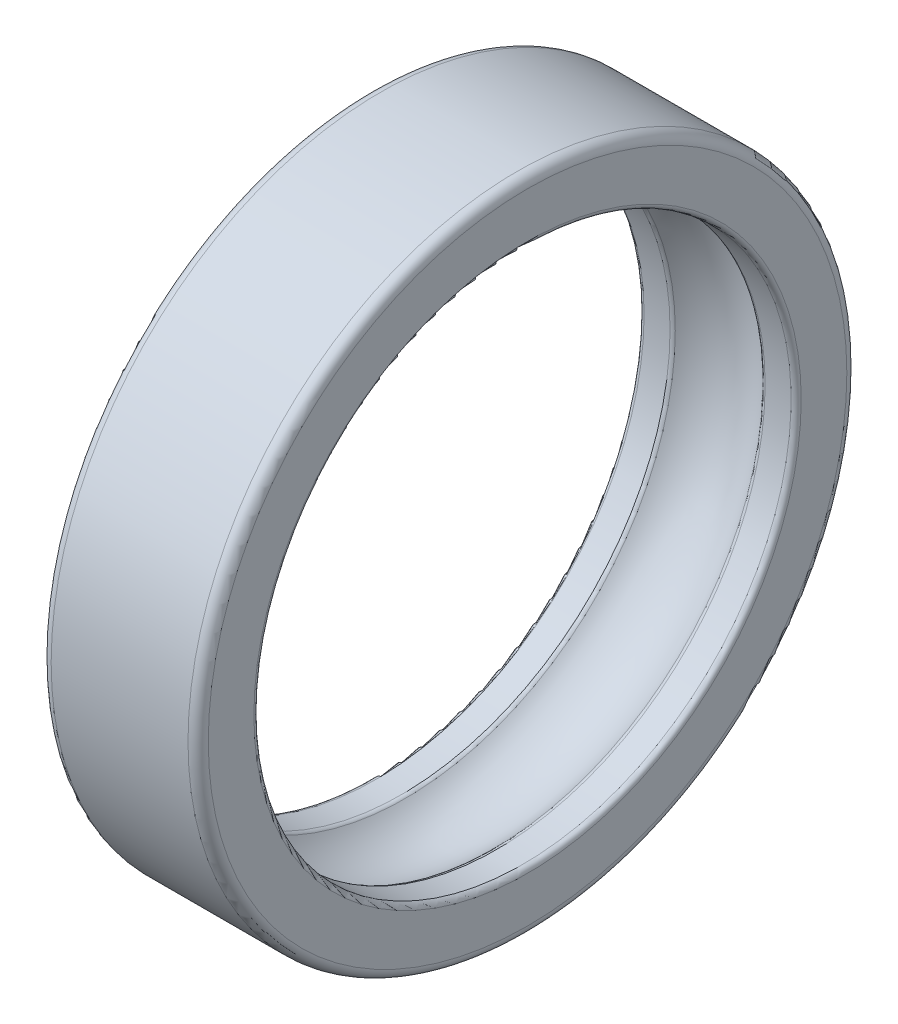
ISO-10303-21;
HEADER;
FILE_DESCRIPTION(('STEP AP214'),'2;1');
FILE_NAME('part.step','',(''),(''),'','','');
FILE_SCHEMA(('AUTOMOTIVE_DESIGN { 1 0 10303 214 1 1 1 1 }'));
ENDSEC;
DATA;
#1=APPLICATION_CONTEXT('core data for automotive mechanical design processes');
#2=APPLICATION_PROTOCOL_DEFINITION('international standard','automotive_design',2000,#1);
#3=PRODUCT_CONTEXT('',#1,'mechanical');
#4=PRODUCT('Part','Part','',(#3));
#5=PRODUCT_RELATED_PRODUCT_CATEGORY('part','',(#4));
#6=PRODUCT_DEFINITION_FORMATION('','',#4);
#7=PRODUCT_DEFINITION_CONTEXT('part definition',#1,'design');
#8=PRODUCT_DEFINITION('design','',#6,#7);
#9=PRODUCT_DEFINITION_SHAPE('','',#8);
#10=(LENGTH_UNIT() NAMED_UNIT(*) SI_UNIT(.MILLI.,.METRE.));
#11=(NAMED_UNIT(*) PLANE_ANGLE_UNIT() SI_UNIT($,.RADIAN.));
#12=(NAMED_UNIT(*) SI_UNIT($,.STERADIAN.) SOLID_ANGLE_UNIT());
#13=UNCERTAINTY_MEASURE_WITH_UNIT(LENGTH_MEASURE(1.E-05),#10,'distance_accuracy_value','');
#14=(GEOMETRIC_REPRESENTATION_CONTEXT(3) GLOBAL_UNCERTAINTY_ASSIGNED_CONTEXT((#13)) GLOBAL_UNIT_ASSIGNED_CONTEXT((#10,
#11,#12)) REPRESENTATION_CONTEXT('',''));
#15=CARTESIAN_POINT('',(0.,0.,0.));
#16=DIRECTION('',(0.,0.,1.));
#17=DIRECTION('',(1.,0.,0.));
#18=AXIS2_PLACEMENT_3D('',#15,#16,#17);
#19=CARTESIAN_POINT('',(15.5,63.,0.));
#20=DIRECTION('',(-1.,0.,0.));
#21=DIRECTION('',(0.,0.,1.));
#22=AXIS2_PLACEMENT_3D('',#19,#20,#21);
#23=PLANE('',#22);
#24=CARTESIAN_POINT('',(15.5,0.,0.));
#25=DIRECTION('',(-1.,0.,0.));
#26=DIRECTION('',(0.,0.,1.));
#27=AXIS2_PLACEMENT_3D('',#24,#25,#26);
#28=CIRCLE('',#27,54.);
#29=CARTESIAN_POINT('',(15.5,0.,54.));
#30=VERTEX_POINT('',#29);
#31=EDGE_CURVE('E48',#30,#30,#28,.T.);
#32=ORIENTED_EDGE('',*,*,#31,.T.);
#33=EDGE_LOOP('',(#32));
#34=FACE_BOUND('',#33,.T.);
#35=CARTESIAN_POINT('',(15.5,0.,0.));
#36=DIRECTION('',(-1.,0.,0.));
#37=DIRECTION('',(0.,0.,1.));
#38=AXIS2_PLACEMENT_3D('',#35,#36,#37);
#39=CIRCLE('',#38,63.);
#40=CARTESIAN_POINT('',(15.5,0.,63.));
#41=VERTEX_POINT('',#40);
#42=EDGE_CURVE('E65',#41,#41,#39,.T.);
#43=ORIENTED_EDGE('',*,*,#42,.F.);
#44=EDGE_LOOP('',(#43));
#45=FACE_BOUND('',#44,.T.);
#46=ADVANCED_FACE('F33',(#34,#45),#23,.F.);
#47=CARTESIAN_POINT('',(13.5,0.,0.));
#48=DIRECTION('',(-1.,0.,0.));
#49=DIRECTION('',(0.,0.,1.));
#50=AXIS2_PLACEMENT_3D('',#47,#48,#49);
#51=TOROIDAL_SURFACE('',#50,63.,2.);
#52=CARTESIAN_POINT('',(13.5,0.,0.));
#53=DIRECTION('',(-1.,0.,0.));
#54=DIRECTION('',(0.,0.,1.));
#55=AXIS2_PLACEMENT_3D('',#52,#53,#54);
#56=CIRCLE('',#55,65.);
#57=CARTESIAN_POINT('',(13.5,0.,65.));
#58=VERTEX_POINT('',#57);
#59=EDGE_CURVE('E68',#58,#58,#56,.T.);
#60=ORIENTED_EDGE('',*,*,#59,.F.);
#61=EDGE_LOOP('',(#60));
#62=FACE_BOUND('',#61,.T.);
#63=ORIENTED_EDGE('',*,*,#42,.T.);
#64=EDGE_LOOP('',(#63));
#65=FACE_BOUND('',#64,.T.);
#66=ADVANCED_FACE('F89',(#62,#65),#51,.T.);
#67=CARTESIAN_POINT('',(0.,0.,0.));
#68=DIRECTION('',(-1.,0.,0.));
#69=DIRECTION('',(0.,0.,1.));
#70=AXIS2_PLACEMENT_3D('',#67,#68,#69);
#71=CYLINDRICAL_SURFACE('',#70,65.);
#72=CARTESIAN_POINT('',(-13.5,0.,0.));
#73=DIRECTION('',(-1.,0.,0.));
#74=DIRECTION('',(0.,0.,1.));
#75=AXIS2_PLACEMENT_3D('',#72,#73,#74);
#76=CIRCLE('',#75,65.);
#77=CARTESIAN_POINT('',(-13.5,0.,65.));
#78=VERTEX_POINT('',#77);
#79=EDGE_CURVE('E71',#78,#78,#76,.T.);
#80=ORIENTED_EDGE('',*,*,#79,.F.);
#81=EDGE_LOOP('',(#80));
#82=FACE_BOUND('',#81,.T.);
#83=ORIENTED_EDGE('',*,*,#59,.T.);
#84=EDGE_LOOP('',(#83));
#85=FACE_BOUND('',#84,.T.);
#86=ADVANCED_FACE('F83',(#82,#85),#71,.T.);
#87=CARTESIAN_POINT('',(-13.5,0.,0.));
#88=DIRECTION('',(-1.,0.,0.));
#89=DIRECTION('',(0.,0.,1.));
#90=AXIS2_PLACEMENT_3D('',#87,#88,#89);
#91=TOROIDAL_SURFACE('',#90,63.,2.);
#92=CARTESIAN_POINT('',(-15.5,0.,0.));
#93=DIRECTION('',(-1.,0.,0.));
#94=DIRECTION('',(0.,0.,1.));
#95=AXIS2_PLACEMENT_3D('',#92,#93,#94);
#96=CIRCLE('',#95,63.);
#97=CARTESIAN_POINT('',(-15.5,0.,63.));
#98=VERTEX_POINT('',#97);
#99=EDGE_CURVE('E74',#98,#98,#96,.T.);
#100=ORIENTED_EDGE('',*,*,#99,.F.);
#101=EDGE_LOOP('',(#100));
#102=FACE_BOUND('',#101,.T.);
#103=ORIENTED_EDGE('',*,*,#79,.T.);
#104=EDGE_LOOP('',(#103));
#105=FACE_BOUND('',#104,.T.);
#106=ADVANCED_FACE('F80',(#102,#105),#91,.T.);
#107=CARTESIAN_POINT('',(-15.5,63.,0.));
#108=DIRECTION('',(1.,0.,0.));
#109=DIRECTION('',(0.,0.,-1.));
#110=AXIS2_PLACEMENT_3D('',#107,#108,#109);
#111=PLANE('',#110);
#112=CARTESIAN_POINT('',(-15.5,0.,0.));
#113=DIRECTION('',(1.,0.,0.));
#114=DIRECTION('',(0.,0.,-1.));
#115=AXIS2_PLACEMENT_3D('',#112,#113,#114);
#116=CIRCLE('',#115,54.);
#117=CARTESIAN_POINT('',(-15.5,0.,-54.));
#118=VERTEX_POINT('',#117);
#119=EDGE_CURVE('E10',#118,#118,#116,.T.);
#120=ORIENTED_EDGE('',*,*,#119,.T.);
#121=EDGE_LOOP('',(#120));
#122=FACE_BOUND('',#121,.T.);
#123=ORIENTED_EDGE('',*,*,#99,.T.);
#124=EDGE_LOOP('',(#123));
#125=FACE_BOUND('',#124,.T.);
#126=ADVANCED_FACE('F78',(#122,#125),#111,.F.);
#127=CARTESIAN_POINT('',(0.,0.,0.));
#128=DIRECTION('',(-1.,0.,0.));
#129=DIRECTION('',(0.,0.,1.));
#130=AXIS2_PLACEMENT_3D('',#127,#128,#129);
#131=CYLINDRICAL_SURFACE('',#130,53.);
#132=CARTESIAN_POINT('',(-14.5,0.,0.));
#133=DIRECTION('',(1.,0.,0.));
#134=DIRECTION('',(0.,0.,-1.));
#135=AXIS2_PLACEMENT_3D('',#132,#133,#134);
#136=CIRCLE('',#135,53.);
#137=CARTESIAN_POINT('',(-14.5,0.,-53.));
#138=VERTEX_POINT('',#137);
#139=EDGE_CURVE('E40',#138,#138,#136,.F.);
#140=ORIENTED_EDGE('',*,*,#139,.T.);
#141=EDGE_LOOP('',(#140));
#142=FACE_BOUND('',#141,.T.);
#143=CARTESIAN_POINT('',(-9.38083151964686,0.,0.));
#144=DIRECTION('',(1.,0.,0.));
#145=DIRECTION('',(0.,0.,-1.));
#146=AXIS2_PLACEMENT_3D('',#143,#144,#145);
#147=CIRCLE('',#146,53.);
#148=CARTESIAN_POINT('',(-9.38083151964686,0.,-53.));
#149=VERTEX_POINT('',#148);
#150=EDGE_CURVE('E44',#149,#149,#147,.T.);
#151=ORIENTED_EDGE('',*,*,#150,.T.);
#152=EDGE_LOOP('',(#151));
#153=FACE_BOUND('',#152,.T.);
#154=ADVANCED_FACE('F128',(#142,#153),#131,.F.);
#155=CARTESIAN_POINT('',(0.,0.,0.));
#156=DIRECTION('',(-1.,0.,0.));
#157=DIRECTION('',(0.,0.,1.));
#158=AXIS2_PLACEMENT_3D('',#155,#156,#157);
#159=TOROIDAL_SURFACE('',#158,45.,12.);
#160=CARTESIAN_POINT('',(8.65922909505863,0.,0.));
#161=DIRECTION('',(-1.,0.,0.));
#162=DIRECTION('',(0.,0.,1.));
#163=AXIS2_PLACEMENT_3D('',#160,#161,#162);
#164=CIRCLE('',#163,53.3076923076923);
#165=CARTESIAN_POINT('',(8.65922909505863,0.,53.3076923076923));
#166=VERTEX_POINT('',#165);
#167=EDGE_CURVE('E53',#166,#166,#164,.F.);
#168=ORIENTED_EDGE('',*,*,#167,.T.);
#169=EDGE_LOOP('',(#168));
#170=FACE_BOUND('',#169,.T.);
#171=CARTESIAN_POINT('',(-8.6592290950586,0.,0.));
#172=DIRECTION('',(1.,0.,0.));
#173=DIRECTION('',(0.,0.,-1.));
#174=AXIS2_PLACEMENT_3D('',#171,#172,#173);
#175=CIRCLE('',#174,53.3076923076923);
#176=CARTESIAN_POINT('',(-8.6592290950586,0.,-53.3076923076923));
#177=VERTEX_POINT('',#176);
#178=EDGE_CURVE('E56',#177,#177,#175,.F.);
#179=ORIENTED_EDGE('',*,*,#178,.T.);
#180=EDGE_LOOP('',(#179));
#181=FACE_BOUND('',#180,.T.);
#182=ADVANCED_FACE('F126',(#170,#181),#159,.F.);
#183=CARTESIAN_POINT('',(0.,0.,0.));
#184=DIRECTION('',(-1.,0.,0.));
#185=DIRECTION('',(0.,0.,1.));
#186=AXIS2_PLACEMENT_3D('',#183,#184,#185);
#187=CYLINDRICAL_SURFACE('',#186,53.);
#188=CARTESIAN_POINT('',(9.38083151964685,0.,0.));
#189=DIRECTION('',(1.,0.,0.));
#190=DIRECTION('',(0.,0.,-1.));
#191=AXIS2_PLACEMENT_3D('',#188,#189,#190);
#192=CIRCLE('',#191,53.);
#193=CARTESIAN_POINT('',(9.38083151964685,0.,-53.));
#194=VERTEX_POINT('',#193);
#195=EDGE_CURVE('E59',#194,#194,#192,.F.);
#196=ORIENTED_EDGE('',*,*,#195,.T.);
#197=EDGE_LOOP('',(#196));
#198=FACE_BOUND('',#197,.T.);
#199=CARTESIAN_POINT('',(14.5,0.,0.));
#200=DIRECTION('',(-1.,0.,0.));
#201=DIRECTION('',(0.,0.,1.));
#202=AXIS2_PLACEMENT_3D('',#199,#200,#201);
#203=CIRCLE('',#202,53.);
#204=CARTESIAN_POINT('',(14.5,0.,53.));
#205=VERTEX_POINT('',#204);
#206=EDGE_CURVE('E62',#205,#205,#203,.F.);
#207=ORIENTED_EDGE('',*,*,#206,.T.);
#208=EDGE_LOOP('',(#207));
#209=FACE_BOUND('',#208,.T.);
#210=ADVANCED_FACE('F108',(#198,#209),#187,.F.);
#211=CARTESIAN_POINT('',(9.38083151964685,0.,0.));
#212=DIRECTION('',(1.,0.,0.));
#213=DIRECTION('',(0.,0.,-1.));
#214=AXIS2_PLACEMENT_3D('',#211,#212,#213);
#215=TOROIDAL_SURFACE('',#214,54.,1.);
#216=ORIENTED_EDGE('',*,*,#167,.F.);
#217=EDGE_LOOP('',(#216));
#218=FACE_BOUND('',#217,.T.);
#219=ORIENTED_EDGE('',*,*,#195,.F.);
#220=EDGE_LOOP('',(#219));
#221=FACE_BOUND('',#220,.T.);
#222=ADVANCED_FACE('F104',(#218,#221),#215,.T.);
#223=CARTESIAN_POINT('',(14.5,0.,0.));
#224=DIRECTION('',(-1.,0.,0.));
#225=DIRECTION('',(0.,0.,1.));
#226=AXIS2_PLACEMENT_3D('',#223,#224,#225);
#227=TOROIDAL_SURFACE('',#226,54.,1.);
#228=ORIENTED_EDGE('',*,*,#206,.F.);
#229=EDGE_LOOP('',(#228));
#230=FACE_BOUND('',#229,.T.);
#231=ORIENTED_EDGE('',*,*,#31,.F.);
#232=EDGE_LOOP('',(#231));
#233=FACE_BOUND('',#232,.T.);
#234=ADVANCED_FACE('F107',(#230,#233),#227,.T.);
#235=CARTESIAN_POINT('',(-14.5,0.,0.));
#236=DIRECTION('',(1.,0.,0.));
#237=DIRECTION('',(0.,0.,-1.));
#238=AXIS2_PLACEMENT_3D('',#235,#236,#237);
#239=TOROIDAL_SURFACE('',#238,54.,1.);
#240=ORIENTED_EDGE('',*,*,#119,.F.);
#241=EDGE_LOOP('',(#240));
#242=FACE_BOUND('',#241,.T.);
#243=ORIENTED_EDGE('',*,*,#139,.F.);
#244=EDGE_LOOP('',(#243));
#245=FACE_BOUND('',#244,.T.);
#246=ADVANCED_FACE('F111',(#242,#245),#239,.T.);
#247=CARTESIAN_POINT('',(-9.38083151964686,0.,0.));
#248=DIRECTION('',(1.,0.,0.));
#249=DIRECTION('',(0.,0.,-1.));
#250=AXIS2_PLACEMENT_3D('',#247,#248,#249);
#251=TOROIDAL_SURFACE('',#250,54.,1.);
#252=ORIENTED_EDGE('',*,*,#150,.F.);
#253=EDGE_LOOP('',(#252));
#254=FACE_BOUND('',#253,.T.);
#255=ORIENTED_EDGE('',*,*,#178,.F.);
#256=EDGE_LOOP('',(#255));
#257=FACE_BOUND('',#256,.T.);
#258=ADVANCED_FACE('F35',(#254,#257),#251,.T.);
#259=CLOSED_SHELL('',(#46,#66,#86,#106,#126,#154,#182,#210,#222,#234,#246,#258));
#260=MANIFOLD_SOLID_BREP('B2',#259);
#261=ADVANCED_BREP_SHAPE_REPRESENTATION('',(#18,#260),#14);
#262=SHAPE_DEFINITION_REPRESENTATION(#9,#261);
ENDSEC;
END-ISO-10303-21;
